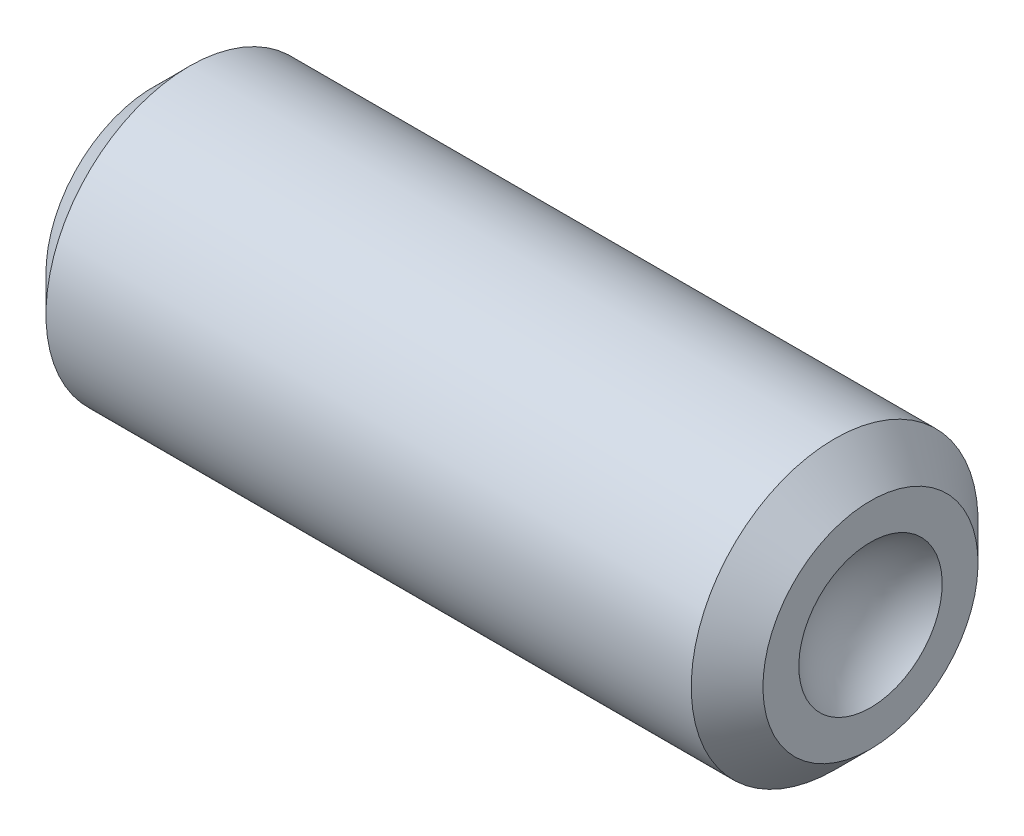
ISO-10303-21;
HEADER;
FILE_DESCRIPTION(('STEP AP214'),'2;1');
FILE_NAME('part.step','',(''),(''),'','','');
FILE_SCHEMA(('AUTOMOTIVE_DESIGN { 1 0 10303 214 1 1 1 1 }'));
ENDSEC;
DATA;
#1=APPLICATION_CONTEXT('core data for automotive mechanical design processes');
#2=APPLICATION_PROTOCOL_DEFINITION('international standard','automotive_design',2000,#1);
#3=PRODUCT_CONTEXT('',#1,'mechanical');
#4=PRODUCT('Part','Part','',(#3));
#5=PRODUCT_RELATED_PRODUCT_CATEGORY('part','',(#4));
#6=PRODUCT_DEFINITION_FORMATION('','',#4);
#7=PRODUCT_DEFINITION_CONTEXT('part definition',#1,'design');
#8=PRODUCT_DEFINITION('design','',#6,#7);
#9=PRODUCT_DEFINITION_SHAPE('','',#8);
#10=(LENGTH_UNIT() NAMED_UNIT(*) SI_UNIT(.MILLI.,.METRE.));
#11=(NAMED_UNIT(*) PLANE_ANGLE_UNIT() SI_UNIT($,.RADIAN.));
#12=(NAMED_UNIT(*) SI_UNIT($,.STERADIAN.) SOLID_ANGLE_UNIT());
#13=UNCERTAINTY_MEASURE_WITH_UNIT(LENGTH_MEASURE(1.E-05),#10,'distance_accuracy_value','');
#14=(GEOMETRIC_REPRESENTATION_CONTEXT(3) GLOBAL_UNCERTAINTY_ASSIGNED_CONTEXT((#13)) GLOBAL_UNIT_ASSIGNED_CONTEXT((#10,
#11,#12)) REPRESENTATION_CONTEXT('',''));
#15=CARTESIAN_POINT('',(0.,0.,0.));
#16=DIRECTION('',(0.,0.,1.));
#17=DIRECTION('',(1.,0.,0.));
#18=AXIS2_PLACEMENT_3D('',#15,#16,#17);
#19=CARTESIAN_POINT('',(0.,0.,0.));
#20=DIRECTION('',(1.,0.,0.));
#21=DIRECTION('',(0.,1.,0.));
#22=AXIS2_PLACEMENT_3D('',#19,#20,#21);
#23=PLANE('',#22);
#24=DIRECTION('',(0.,-0.5,-0.866025403784439));
#25=VECTOR('',#24,1.);
#26=CARTESIAN_POINT('',(0.,1.15470053837925,0.));
#27=LINE('',#26,#25);
#28=CARTESIAN_POINT('',(0.,1.15470053837925,0.));
#29=VERTEX_POINT('',#28);
#30=CARTESIAN_POINT('',(0.,0.577350269189626,-1.));
#31=VERTEX_POINT('',#30);
#32=EDGE_CURVE('E107',#29,#31,#27,.T.);
#33=ORIENTED_EDGE('',*,*,#32,.F.);
#34=DIRECTION('',(0.,0.5,-0.866025403784438));
#35=VECTOR('',#34,1.);
#36=CARTESIAN_POINT('',(0.,0.577350269189626,1.));
#37=LINE('',#36,#35);
#38=CARTESIAN_POINT('',(0.,0.577350269189626,1.));
#39=VERTEX_POINT('',#38);
#40=EDGE_CURVE('E49',#39,#29,#37,.T.);
#41=ORIENTED_EDGE('',*,*,#40,.F.);
#42=DIRECTION('',(0.,1.,0.));
#43=VECTOR('',#42,1.);
#44=CARTESIAN_POINT('',(0.,-0.577350269189626,1.));
#45=LINE('',#44,#43);
#46=CARTESIAN_POINT('',(0.,-0.577350269189626,1.));
#47=VERTEX_POINT('',#46);
#48=EDGE_CURVE('E122',#47,#39,#45,.T.);
#49=ORIENTED_EDGE('',*,*,#48,.F.);
#50=DIRECTION('',(0.,0.5,0.866025403784439));
#51=VECTOR('',#50,1.);
#52=CARTESIAN_POINT('',(0.,-1.15470053837925,0.));
#53=LINE('',#52,#51);
#54=CARTESIAN_POINT('',(0.,-1.15470053837925,0.));
#55=VERTEX_POINT('',#54);
#56=EDGE_CURVE('E116',#55,#47,#53,.T.);
#57=ORIENTED_EDGE('',*,*,#56,.F.);
#58=DIRECTION('',(0.,-0.5,0.866025403784438));
#59=VECTOR('',#58,1.);
#60=CARTESIAN_POINT('',(0.,-0.577350269189625,-1.));
#61=LINE('',#60,#59);
#62=CARTESIAN_POINT('',(0.,-0.577350269189625,-1.));
#63=VERTEX_POINT('',#62);
#64=EDGE_CURVE('E114',#63,#55,#61,.T.);
#65=ORIENTED_EDGE('',*,*,#64,.F.);
#66=DIRECTION('',(0.,-1.,0.));
#67=VECTOR('',#66,1.);
#68=CARTESIAN_POINT('',(0.,0.577350269189626,-1.));
#69=LINE('',#68,#67);
#70=EDGE_CURVE('E100',#31,#63,#69,.T.);
#71=ORIENTED_EDGE('',*,*,#70,.F.);
#72=EDGE_LOOP('',(#33,#41,#49,#57,#65,#71));
#73=FACE_BOUND('',#72,.T.);
#74=CARTESIAN_POINT('',(0.,0.,0.));
#75=DIRECTION('',(-1.,0.,0.));
#76=DIRECTION('',(0.,-1.,0.));
#77=AXIS2_PLACEMENT_3D('',#74,#75,#76);
#78=CIRCLE('',#77,1.5);
#79=CARTESIAN_POINT('',(0.,-1.5,0.));
#80=VERTEX_POINT('',#79);
#81=EDGE_CURVE('E12',#80,#80,#78,.T.);
#82=ORIENTED_EDGE('',*,*,#81,.T.);
#83=EDGE_LOOP('',(#82));
#84=FACE_BOUND('',#83,.T.);
#85=ADVANCED_FACE('F35',(#73,#84),#23,.F.);
#86=CARTESIAN_POINT('',(0.500000000000001,0.,0.));
#87=DIRECTION('',(1.,0.,0.));
#88=DIRECTION('',(0.,1.,0.));
#89=AXIS2_PLACEMENT_3D('',#86,#87,#88);
#90=CONICAL_SURFACE('',#89,2.,0.785398163397447);
#91=ORIENTED_EDGE('',*,*,#81,.F.);
#92=EDGE_LOOP('',(#91));
#93=FACE_BOUND('',#92,.T.);
#94=CARTESIAN_POINT('',(0.500000000000001,0.,0.));
#95=DIRECTION('',(-1.,0.,0.));
#96=DIRECTION('',(0.,-1.,0.));
#97=AXIS2_PLACEMENT_3D('',#94,#95,#96);
#98=CIRCLE('',#97,2.);
#99=CARTESIAN_POINT('',(0.500000000000001,-2.,0.));
#100=VERTEX_POINT('',#99);
#101=EDGE_CURVE('E42',#100,#100,#98,.T.);
#102=ORIENTED_EDGE('',*,*,#101,.T.);
#103=EDGE_LOOP('',(#102));
#104=FACE_BOUND('',#103,.T.);
#105=ADVANCED_FACE('F145',(#93,#104),#90,.T.);
#106=CARTESIAN_POINT('',(0.,0.,0.));
#107=DIRECTION('',(-1.,0.,0.));
#108=DIRECTION('',(0.,-1.,0.));
#109=AXIS2_PLACEMENT_3D('',#106,#107,#108);
#110=CYLINDRICAL_SURFACE('',#109,2.);
#111=ORIENTED_EDGE('',*,*,#101,.F.);
#112=EDGE_LOOP('',(#111));
#113=FACE_BOUND('',#112,.T.);
#114=CARTESIAN_POINT('',(9.5,0.,0.));
#115=DIRECTION('',(-1.,0.,0.));
#116=DIRECTION('',(0.,-1.,0.));
#117=AXIS2_PLACEMENT_3D('',#114,#115,#116);
#118=CIRCLE('',#117,2.);
#119=CARTESIAN_POINT('',(9.5,-2.,0.));
#120=VERTEX_POINT('',#119);
#121=EDGE_CURVE('E140',#120,#120,#118,.T.);
#122=ORIENTED_EDGE('',*,*,#121,.T.);
#123=EDGE_LOOP('',(#122));
#124=FACE_BOUND('',#123,.T.);
#125=ADVANCED_FACE('F147',(#113,#124),#110,.T.);
#126=CARTESIAN_POINT('',(10.,0.,0.));
#127=DIRECTION('',(-1.,0.,0.));
#128=DIRECTION('',(0.,-1.,0.));
#129=AXIS2_PLACEMENT_3D('',#126,#127,#128);
#130=CONICAL_SURFACE('',#129,1.5,0.785398163397446);
#131=ORIENTED_EDGE('',*,*,#121,.F.);
#132=EDGE_LOOP('',(#131));
#133=FACE_BOUND('',#132,.T.);
#134=CARTESIAN_POINT('',(10.,0.,0.));
#135=DIRECTION('',(-1.,0.,0.));
#136=DIRECTION('',(0.,-1.,0.));
#137=AXIS2_PLACEMENT_3D('',#134,#135,#136);
#138=CIRCLE('',#137,1.5);
#139=CARTESIAN_POINT('',(10.,-1.5,0.));
#140=VERTEX_POINT('',#139);
#141=EDGE_CURVE('E137',#140,#140,#138,.T.);
#142=ORIENTED_EDGE('',*,*,#141,.T.);
#143=EDGE_LOOP('',(#142));
#144=FACE_BOUND('',#143,.T.);
#145=ADVANCED_FACE('F150',(#133,#144),#130,.T.);
#146=CARTESIAN_POINT('',(10.,1.5,0.));
#147=DIRECTION('',(-1.,0.,0.));
#148=DIRECTION('',(0.,-1.,0.));
#149=AXIS2_PLACEMENT_3D('',#146,#147,#148);
#150=PLANE('',#149);
#151=ORIENTED_EDGE('',*,*,#141,.F.);
#152=EDGE_LOOP('',(#151));
#153=FACE_BOUND('',#152,.T.);
#154=CARTESIAN_POINT('',(10.,0.,0.));
#155=DIRECTION('',(-1.,0.,0.));
#156=DIRECTION('',(0.,-1.,0.));
#157=AXIS2_PLACEMENT_3D('',#154,#155,#156);
#158=CIRCLE('',#157,1.);
#159=CARTESIAN_POINT('',(10.,-1.,0.));
#160=VERTEX_POINT('',#159);
#161=EDGE_CURVE('E134',#160,#160,#158,.T.);
#162=ORIENTED_EDGE('',*,*,#161,.T.);
#163=EDGE_LOOP('',(#162));
#164=FACE_BOUND('',#163,.T.);
#165=ADVANCED_FACE('F156',(#153,#164),#150,.F.);
#166=CARTESIAN_POINT('',(10.75,0.,0.));
#167=DIRECTION('',(-1.,0.,0.));
#168=DIRECTION('',(0.,-1.,0.));
#169=AXIS2_PLACEMENT_3D('',#166,#167,#168);
#170=SPHERICAL_SURFACE('',#169,1.25);
#171=ORIENTED_EDGE('',*,*,#161,.F.);
#172=EDGE_LOOP('',(#171));
#173=FACE_BOUND('',#172,.T.);
#174=ADVANCED_FACE('F162',(#173),#170,.F.);
#175=CARTESIAN_POINT('',(13.0550504633039,0.577350269189626,1.));
#176=DIRECTION('',(0.,0.866025403784439,0.5));
#177=DIRECTION('',(0.,-0.5,0.866025403784439));
#178=AXIS2_PLACEMENT_3D('',#175,#176,#177);
#179=PLANE('',#178);
#180=DIRECTION('',(0.,-0.5,0.866025403784439));
#181=VECTOR('',#180,1.);
#182=CARTESIAN_POINT('',(8.,0.577350269189626,1.));
#183=LINE('',#182,#181);
#184=CARTESIAN_POINT('',(8.,1.15470053837925,0.));
#185=VERTEX_POINT('',#184);
#186=CARTESIAN_POINT('',(8.,0.577350269189626,1.));
#187=VERTEX_POINT('',#186);
#188=EDGE_CURVE('E68',#185,#187,#183,.T.);
#189=ORIENTED_EDGE('',*,*,#188,.T.);
#190=DIRECTION('',(-1.,0.,0.));
#191=VECTOR('',#190,1.);
#192=CARTESIAN_POINT('',(13.0550504633039,0.577350269189626,1.));
#193=LINE('',#192,#191);
#194=EDGE_CURVE('E125',#187,#39,#193,.T.);
#195=ORIENTED_EDGE('',*,*,#194,.T.);
#196=ORIENTED_EDGE('',*,*,#40,.T.);
#197=DIRECTION('',(-1.,0.,0.));
#198=VECTOR('',#197,1.);
#199=CARTESIAN_POINT('',(13.0550504633039,1.15470053837925,0.));
#200=LINE('',#199,#198);
#201=EDGE_CURVE('E104',#185,#29,#200,.T.);
#202=ORIENTED_EDGE('',*,*,#201,.F.);
#203=EDGE_LOOP('',(#189,#195,#196,#202));
#204=FACE_BOUND('',#203,.T.);
#205=ADVANCED_FACE('F167',(#204),#179,.F.);
#206=CARTESIAN_POINT('',(13.0550504633039,-0.577350269189626,1.));
#207=DIRECTION('',(0.,0.,1.));
#208=DIRECTION('',(1.,0.,0.));
#209=AXIS2_PLACEMENT_3D('',#206,#207,#208);
#210=PLANE('',#209);
#211=DIRECTION('',(0.,-1.,0.));
#212=VECTOR('',#211,1.);
#213=CARTESIAN_POINT('',(8.,-0.577350269189626,1.));
#214=LINE('',#213,#212);
#215=CARTESIAN_POINT('',(8.,-0.577350269189626,1.));
#216=VERTEX_POINT('',#215);
#217=EDGE_CURVE('E267',#187,#216,#214,.T.);
#218=ORIENTED_EDGE('',*,*,#217,.T.);
#219=DIRECTION('',(-1.,0.,0.));
#220=VECTOR('',#219,1.);
#221=CARTESIAN_POINT('',(13.0550504633039,-0.577350269189626,1.));
#222=LINE('',#221,#220);
#223=EDGE_CURVE('E127',#216,#47,#222,.T.);
#224=ORIENTED_EDGE('',*,*,#223,.T.);
#225=ORIENTED_EDGE('',*,*,#48,.T.);
#226=ORIENTED_EDGE('',*,*,#194,.F.);
#227=EDGE_LOOP('',(#218,#224,#225,#226));
#228=FACE_BOUND('',#227,.T.);
#229=ADVANCED_FACE('F172',(#228),#210,.F.);
#230=CARTESIAN_POINT('',(13.0550504633039,-1.15470053837925,0.));
#231=DIRECTION('',(0.,-0.866025403784439,0.5));
#232=DIRECTION('',(0.,-0.5,-0.866025403784439));
#233=AXIS2_PLACEMENT_3D('',#230,#231,#232);
#234=PLANE('',#233);
#235=DIRECTION('',(0.,-0.5,-0.866025403784439));
#236=VECTOR('',#235,1.);
#237=CARTESIAN_POINT('',(8.,-1.15470053837925,0.));
#238=LINE('',#237,#236);
#239=CARTESIAN_POINT('',(8.,-1.15470053837925,0.));
#240=VERTEX_POINT('',#239);
#241=EDGE_CURVE('E270',#216,#240,#238,.T.);
#242=ORIENTED_EDGE('',*,*,#241,.T.);
#243=DIRECTION('',(-1.,0.,0.));
#244=VECTOR('',#243,1.);
#245=CARTESIAN_POINT('',(13.0550504633039,-1.15470053837925,0.));
#246=LINE('',#245,#244);
#247=EDGE_CURVE('E129',#240,#55,#246,.T.);
#248=ORIENTED_EDGE('',*,*,#247,.T.);
#249=ORIENTED_EDGE('',*,*,#56,.T.);
#250=ORIENTED_EDGE('',*,*,#223,.F.);
#251=EDGE_LOOP('',(#242,#248,#249,#250));
#252=FACE_BOUND('',#251,.T.);
#253=ADVANCED_FACE('F217',(#252),#234,.F.);
#254=CARTESIAN_POINT('',(13.0550504633039,-0.577350269189626,-1.));
#255=DIRECTION('',(0.,-0.866025403784439,-0.5));
#256=DIRECTION('',(0.,0.5,-0.866025403784439));
#257=AXIS2_PLACEMENT_3D('',#254,#255,#256);
#258=PLANE('',#257);
#259=DIRECTION('',(0.,0.5,-0.866025403784439));
#260=VECTOR('',#259,1.);
#261=CARTESIAN_POINT('',(8.,-0.577350269189626,-1.));
#262=LINE('',#261,#260);
#263=CARTESIAN_POINT('',(8.,-0.577350269189626,-1.));
#264=VERTEX_POINT('',#263);
#265=EDGE_CURVE('E58',#240,#264,#262,.T.);
#266=ORIENTED_EDGE('',*,*,#265,.T.);
#267=DIRECTION('',(-1.,0.,0.));
#268=VECTOR('',#267,1.);
#269=CARTESIAN_POINT('',(13.0550504633039,-0.577350269189626,-1.));
#270=LINE('',#269,#268);
#271=EDGE_CURVE('E103',#264,#63,#270,.T.);
#272=ORIENTED_EDGE('',*,*,#271,.T.);
#273=ORIENTED_EDGE('',*,*,#64,.T.);
#274=ORIENTED_EDGE('',*,*,#247,.F.);
#275=EDGE_LOOP('',(#266,#272,#273,#274));
#276=FACE_BOUND('',#275,.T.);
#277=ADVANCED_FACE('F227',(#276),#258,.F.);
#278=CARTESIAN_POINT('',(13.0550504633039,0.577350269189626,-1.));
#279=DIRECTION('',(0.,0.,-1.));
#280=DIRECTION('',(-1.,0.,0.));
#281=AXIS2_PLACEMENT_3D('',#278,#279,#280);
#282=PLANE('',#281);
#283=DIRECTION('',(0.,1.,0.));
#284=VECTOR('',#283,1.);
#285=CARTESIAN_POINT('',(8.,0.577350269189626,-1.));
#286=LINE('',#285,#284);
#287=CARTESIAN_POINT('',(8.,0.577350269189626,-1.));
#288=VERTEX_POINT('',#287);
#289=EDGE_CURVE('E102',#264,#288,#286,.T.);
#290=ORIENTED_EDGE('',*,*,#289,.T.);
#291=DIRECTION('',(-1.,0.,0.));
#292=VECTOR('',#291,1.);
#293=CARTESIAN_POINT('',(13.0550504633039,0.577350269189626,-1.));
#294=LINE('',#293,#292);
#295=EDGE_CURVE('E95',#288,#31,#294,.T.);
#296=ORIENTED_EDGE('',*,*,#295,.T.);
#297=ORIENTED_EDGE('',*,*,#70,.T.);
#298=ORIENTED_EDGE('',*,*,#271,.F.);
#299=EDGE_LOOP('',(#290,#296,#297,#298));
#300=FACE_BOUND('',#299,.T.);
#301=ADVANCED_FACE('F97',(#300),#282,.F.);
#302=CARTESIAN_POINT('',(13.0550504633039,1.15470053837925,0.));
#303=DIRECTION('',(0.,0.866025403784439,-0.5));
#304=DIRECTION('',(0.,0.5,0.866025403784439));
#305=AXIS2_PLACEMENT_3D('',#302,#303,#304);
#306=PLANE('',#305);
#307=DIRECTION('',(0.,0.5,0.866025403784439));
#308=VECTOR('',#307,1.);
#309=CARTESIAN_POINT('',(8.,1.15470053837925,0.));
#310=LINE('',#309,#308);
#311=EDGE_CURVE('E77',#288,#185,#310,.T.);
#312=ORIENTED_EDGE('',*,*,#311,.T.);
#313=ORIENTED_EDGE('',*,*,#201,.T.);
#314=ORIENTED_EDGE('',*,*,#32,.T.);
#315=ORIENTED_EDGE('',*,*,#295,.F.);
#316=EDGE_LOOP('',(#312,#313,#314,#315));
#317=FACE_BOUND('',#316,.T.);
#318=ADVANCED_FACE('F108',(#317),#306,.F.);
#319=CARTESIAN_POINT('',(8.,1.5,0.));
#320=DIRECTION('',(-1.,0.,0.));
#321=DIRECTION('',(0.,-1.,0.));
#322=AXIS2_PLACEMENT_3D('',#319,#320,#321);
#323=PLANE('',#322);
#324=ORIENTED_EDGE('',*,*,#188,.F.);
#325=ORIENTED_EDGE('',*,*,#311,.F.);
#326=ORIENTED_EDGE('',*,*,#289,.F.);
#327=ORIENTED_EDGE('',*,*,#265,.F.);
#328=ORIENTED_EDGE('',*,*,#241,.F.);
#329=ORIENTED_EDGE('',*,*,#217,.F.);
#330=EDGE_LOOP('',(#324,#325,#326,#327,#328,#329));
#331=FACE_BOUND('',#330,.T.);
#332=ADVANCED_FACE('F253',(#331),#323,.T.);
#333=CLOSED_SHELL('',(#85,#105,#125,#145,#165,#174,#205,#229,#253,#277,#301,#318,#332));
#334=MANIFOLD_SOLID_BREP('B2',#333);
#335=ADVANCED_BREP_SHAPE_REPRESENTATION('',(#18,#334),#14);
#336=SHAPE_DEFINITION_REPRESENTATION(#9,#335);
ENDSEC;
END-ISO-10303-21;
